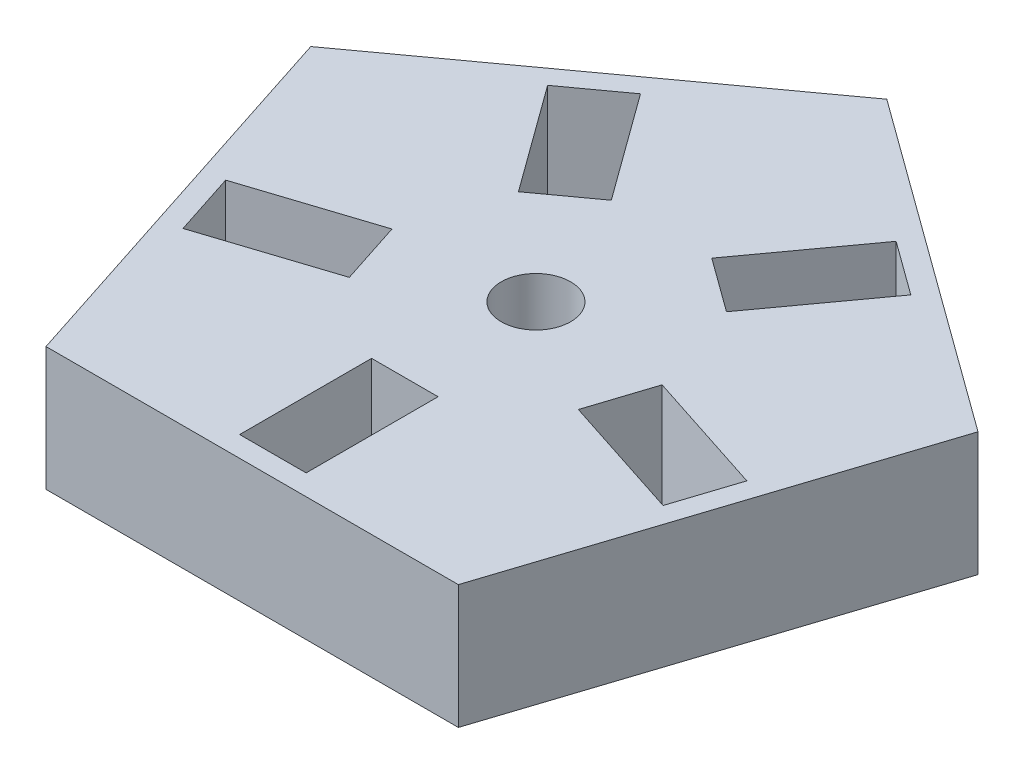
ISO-10303-21;
HEADER;
FILE_DESCRIPTION(('STEP AP214'),'2;1');
FILE_NAME('part.step','',(''),(''),'','','');
FILE_SCHEMA(('AUTOMOTIVE_DESIGN { 1 0 10303 214 1 1 1 1 }'));
ENDSEC;
DATA;
#1=APPLICATION_CONTEXT('core data for automotive mechanical design processes');
#2=APPLICATION_PROTOCOL_DEFINITION('international standard','automotive_design',2000,#1);
#3=PRODUCT_CONTEXT('',#1,'mechanical');
#4=PRODUCT('Part','Part','',(#3));
#5=PRODUCT_RELATED_PRODUCT_CATEGORY('part','',(#4));
#6=PRODUCT_DEFINITION_FORMATION('','',#4);
#7=PRODUCT_DEFINITION_CONTEXT('part definition',#1,'design');
#8=PRODUCT_DEFINITION('design','',#6,#7);
#9=PRODUCT_DEFINITION_SHAPE('','',#8);
#10=(LENGTH_UNIT() NAMED_UNIT(*) SI_UNIT(.MILLI.,.METRE.));
#11=(NAMED_UNIT(*) PLANE_ANGLE_UNIT() SI_UNIT($,.RADIAN.));
#12=(NAMED_UNIT(*) SI_UNIT($,.STERADIAN.) SOLID_ANGLE_UNIT());
#13=UNCERTAINTY_MEASURE_WITH_UNIT(LENGTH_MEASURE(1.E-05),#10,'distance_accuracy_value','');
#14=(GEOMETRIC_REPRESENTATION_CONTEXT(3) GLOBAL_UNCERTAINTY_ASSIGNED_CONTEXT((#13)) GLOBAL_UNIT_ASSIGNED_CONTEXT((#10,
#11,#12)) REPRESENTATION_CONTEXT('',''));
#15=CARTESIAN_POINT('',(0.,0.,0.));
#16=DIRECTION('',(0.,0.,1.));
#17=DIRECTION('',(1.,0.,0.));
#18=AXIS2_PLACEMENT_3D('',#15,#16,#17);
#19=CARTESIAN_POINT('',(-63.5056503261382,38.1,87.3827706180711));
#20=DIRECTION('',(-0.951065450191528,0.,0.308989497316633));
#21=DIRECTION('',(0.308989497316633,0.,0.951065450191528));
#22=AXIS2_PLACEMENT_3D('',#19,#20,#21);
#23=PLANE('',#22);
#24=DIRECTION('',(-0.308989497316633,0.,-0.951065450191529));
#25=VECTOR('',#24,1.);
#26=CARTESIAN_POINT('',(-63.5056503261382,0.,87.3827706180711));
#27=LINE('',#26,#25);
#28=CARTESIAN_POINT('',(-63.5056503261382,0.,87.3827706180711));
#29=VERTEX_POINT('',#28);
#30=CARTESIAN_POINT('',(-102.747316485351,0.,-33.402541556253));
#31=VERTEX_POINT('',#30);
#32=EDGE_CURVE('E367',#29,#31,#27,.T.);
#33=ORIENTED_EDGE('',*,*,#32,.F.);
#34=DIRECTION('',(0.,-1.,0.));
#35=VECTOR('',#34,1.);
#36=CARTESIAN_POINT('',(-63.5056503261382,38.1,87.3827706180711));
#37=LINE('',#36,#35);
#38=CARTESIAN_POINT('',(-63.5056503261382,38.1,87.3827706180711));
#39=VERTEX_POINT('',#38);
#40=EDGE_CURVE('E11',#39,#29,#37,.T.);
#41=ORIENTED_EDGE('',*,*,#40,.F.);
#42=DIRECTION('',(-0.308989497316633,0.,-0.951065450191529));
#43=VECTOR('',#42,1.);
#44=CARTESIAN_POINT('',(-63.5056503261382,38.1,87.3827706180711));
#45=LINE('',#44,#43);
#46=CARTESIAN_POINT('',(-102.747316485351,38.1,-33.402541556253));
#47=VERTEX_POINT('',#46);
#48=EDGE_CURVE('E374',#39,#47,#45,.T.);
#49=ORIENTED_EDGE('',*,*,#48,.T.);
#50=DIRECTION('',(0.,-1.,0.));
#51=VECTOR('',#50,1.);
#52=CARTESIAN_POINT('',(-102.747316485351,38.1,-33.402541556253));
#53=LINE('',#52,#51);
#54=EDGE_CURVE('E38',#47,#31,#53,.T.);
#55=ORIENTED_EDGE('',*,*,#54,.T.);
#56=EDGE_LOOP('',(#33,#41,#49,#55));
#57=FACE_BOUND('',#56,.T.);
#58=ADVANCED_FACE('F35',(#57),#23,.T.);
#59=CARTESIAN_POINT('',(63.4943496207819,38.1,87.3864424398222));
#60=DIRECTION('',(-2.8911982291864E-05,0.,0.999999999582049));
#61=DIRECTION('',(0.999999999582049,0.,2.8911982291864E-05));
#62=AXIS2_PLACEMENT_3D('',#59,#60,#61);
#63=PLANE('',#62);
#64=DIRECTION('',(-0.999999999582049,0.,-2.8911982291864E-05));
#65=VECTOR('',#64,1.);
#66=CARTESIAN_POINT('',(63.4943496207819,0.,87.3864424398222));
#67=LINE('',#66,#65);
#68=CARTESIAN_POINT('',(63.4943496207819,0.,87.3864424398222));
#69=VERTEX_POINT('',#68);
#70=EDGE_CURVE('E378',#69,#29,#67,.T.);
#71=ORIENTED_EDGE('',*,*,#70,.F.);
#72=DIRECTION('',(0.,-1.,0.));
#73=VECTOR('',#72,1.);
#74=CARTESIAN_POINT('',(63.4943496207819,38.1,87.3864424398222));
#75=LINE('',#74,#73);
#76=CARTESIAN_POINT('',(63.4943496207819,38.1,87.3864424398222));
#77=VERTEX_POINT('',#76);
#78=EDGE_CURVE('E43',#77,#69,#75,.T.);
#79=ORIENTED_EDGE('',*,*,#78,.F.);
#80=DIRECTION('',(-0.999999999582049,0.,-2.8911982291864E-05));
#81=VECTOR('',#80,1.);
#82=CARTESIAN_POINT('',(63.4943496207819,38.1,87.3864424398222));
#83=LINE('',#82,#81);
#84=EDGE_CURVE('E387',#77,#39,#83,.T.);
#85=ORIENTED_EDGE('',*,*,#84,.T.);
#86=ORIENTED_EDGE('',*,*,#40,.T.);
#87=EDGE_LOOP('',(#71,#79,#85,#86));
#88=FACE_BOUND('',#87,.T.);
#89=ADVANCED_FACE('F418',(#88),#63,.T.);
#90=CARTESIAN_POINT('',(102.743,38.1,-33.3966004238582));
#91=DIRECTION('',(0.95104758160379,0.,0.309044491174947));
#92=DIRECTION('',(0.309044491174947,0.,-0.95104758160379));
#93=AXIS2_PLACEMENT_3D('',#90,#91,#92);
#94=PLANE('',#93);
#95=DIRECTION('',(-0.309044491174947,0.,0.95104758160379));
#96=VECTOR('',#95,1.);
#97=CARTESIAN_POINT('',(102.743,0.,-33.3966004238582));
#98=LINE('',#97,#96);
#99=CARTESIAN_POINT('',(102.743,0.,-33.3966004238582));
#100=VERTEX_POINT('',#99);
#101=EDGE_CURVE('E398',#100,#69,#98,.T.);
#102=ORIENTED_EDGE('',*,*,#101,.F.);
#103=DIRECTION('',(0.,-1.,0.));
#104=VECTOR('',#103,1.);
#105=CARTESIAN_POINT('',(102.743,38.1,-33.3966004238582));
#106=LINE('',#105,#104);
#107=CARTESIAN_POINT('',(102.743,38.1,-33.3966004238582));
#108=VERTEX_POINT('',#107);
#109=EDGE_CURVE('E404',#108,#100,#106,.T.);
#110=ORIENTED_EDGE('',*,*,#109,.F.);
#111=DIRECTION('',(-0.309044491174947,0.,0.95104758160379));
#112=VECTOR('',#111,1.);
#113=CARTESIAN_POINT('',(102.743,38.1,-33.3966004238582));
#114=LINE('',#113,#112);
#115=EDGE_CURVE('E384',#108,#77,#114,.T.);
#116=ORIENTED_EDGE('',*,*,#115,.T.);
#117=ORIENTED_EDGE('',*,*,#78,.T.);
#118=EDGE_LOOP('',(#102,#110,#116,#117));
#119=FACE_BOUND('',#118,.T.);
#120=ADVANCED_FACE('F427',(#119),#94,.T.);
#121=CARTESIAN_POINT('',(0.,38.1,-108.048298));
#122=DIRECTION('',(0.58780864233183,0.,-0.809000000000007));
#123=DIRECTION('',(-0.809000000000007,0.,-0.58780864233183));
#124=AXIS2_PLACEMENT_3D('',#121,#122,#123);
#125=PLANE('',#124);
#126=DIRECTION('',(0.809000000000007,0.,0.58780864233183));
#127=VECTOR('',#126,1.);
#128=CARTESIAN_POINT('',(0.,0.,-108.048298));
#129=LINE('',#128,#127);
#130=CARTESIAN_POINT('',(0.,0.,-108.048298));
#131=VERTEX_POINT('',#130);
#132=EDGE_CURVE('E395',#131,#100,#129,.T.);
#133=ORIENTED_EDGE('',*,*,#132,.F.);
#134=DIRECTION('',(0.,-1.,0.));
#135=VECTOR('',#134,1.);
#136=CARTESIAN_POINT('',(0.,38.1,-108.048298));
#137=LINE('',#136,#135);
#138=CARTESIAN_POINT('',(0.,38.1,-108.048298));
#139=VERTEX_POINT('',#138);
#140=EDGE_CURVE('E405',#139,#131,#137,.T.);
#141=ORIENTED_EDGE('',*,*,#140,.F.);
#142=DIRECTION('',(0.809000000000007,0.,0.58780864233183));
#143=VECTOR('',#142,1.);
#144=CARTESIAN_POINT('',(0.,38.1,-108.048298));
#145=LINE('',#144,#143);
#146=EDGE_CURVE('E381',#139,#108,#145,.T.);
#147=ORIENTED_EDGE('',*,*,#146,.T.);
#148=ORIENTED_EDGE('',*,*,#109,.T.);
#149=EDGE_LOOP('',(#133,#141,#147,#148));
#150=FACE_BOUND('',#149,.T.);
#151=ADVANCED_FACE('F425',(#150),#125,.T.);
#152=CARTESIAN_POINT('',(-102.747316485351,38.1,-33.402541556253));
#153=DIRECTION('',(-0.587761861761788,0.,-0.809033988073627));
#154=DIRECTION('',(-0.809033988073627,0.,0.587761861761788));
#155=AXIS2_PLACEMENT_3D('',#152,#153,#154);
#156=PLANE('',#155);
#157=DIRECTION('',(0.809033988073627,0.,-0.587761861761788));
#158=VECTOR('',#157,1.);
#159=CARTESIAN_POINT('',(-102.747316485351,0.,-33.402541556253));
#160=LINE('',#159,#158);
#161=EDGE_CURVE('E392',#31,#131,#160,.T.);
#162=ORIENTED_EDGE('',*,*,#161,.F.);
#163=ORIENTED_EDGE('',*,*,#54,.F.);
#164=DIRECTION('',(0.809033988073627,0.,-0.587761861761788));
#165=VECTOR('',#164,1.);
#166=CARTESIAN_POINT('',(-102.747316485351,38.1,-33.402541556253));
#167=LINE('',#166,#165);
#168=EDGE_CURVE('E377',#47,#139,#167,.T.);
#169=ORIENTED_EDGE('',*,*,#168,.T.);
#170=ORIENTED_EDGE('',*,*,#140,.T.);
#171=EDGE_LOOP('',(#162,#163,#169,#170));
#172=FACE_BOUND('',#171,.T.);
#173=ADVANCED_FACE('F413',(#172),#156,.T.);
#174=CARTESIAN_POINT('',(0.,38.1,0.));
#175=DIRECTION('',(0.,-1.,0.));
#176=DIRECTION('',(0.,0.,-1.));
#177=AXIS2_PLACEMENT_3D('',#174,#175,#176);
#178=PLANE('',#177);
#179=CARTESIAN_POINT('',(0.,38.1,0.));
#180=DIRECTION('',(0.,-1.,0.));
#181=DIRECTION('',(0.,0.,-1.));
#182=AXIS2_PLACEMENT_3D('',#179,#180,#181);
#183=CIRCLE('',#182,10.680701413558);
#184=CARTESIAN_POINT('',(0.,38.1,-10.680701413558));
#185=VERTEX_POINT('',#184);
#186=EDGE_CURVE('E296',#185,#185,#183,.T.);
#187=ORIENTED_EDGE('',*,*,#186,.T.);
#188=EDGE_LOOP('',(#187));
#189=FACE_BOUND('',#188,.T.);
#190=DIRECTION('',(-0.30901699437496,0.,-0.951056516295149));
#191=VECTOR('',#190,1.);
#192=CARTESIAN_POINT('',(-35.2482917321554,38.1,22.2366078422844));
#193=LINE('',#192,#191);
#194=CARTESIAN_POINT('',(-35.2482917321554,38.1,22.2366078422844));
#195=VERTEX_POINT('',#194);
#196=CARTESIAN_POINT('',(-41.5746112477973,38.1,2.76619841808353));
#197=VERTEX_POINT('',#196);
#198=EDGE_CURVE('E295',#195,#197,#193,.T.);
#199=ORIENTED_EDGE('',*,*,#198,.F.);
#200=DIRECTION('',(0.95105651629515,0.,-0.30901699437496));
#201=VECTOR('',#200,1.);
#202=CARTESIAN_POINT('',(-73.8992285543903,38.1,34.7950584936827));
#203=LINE('',#202,#201);
#204=CARTESIAN_POINT('',(-73.8992285543903,38.1,34.7950584936827));
#205=VERTEX_POINT('',#204);
#206=EDGE_CURVE('E51',#205,#195,#203,.T.);
#207=ORIENTED_EDGE('',*,*,#206,.F.);
#208=DIRECTION('',(0.30901699437496,0.,0.95105651629515));
#209=VECTOR('',#208,1.);
#210=CARTESIAN_POINT('',(-73.8992285543903,38.1,34.7950584936827));
#211=LINE('',#210,#209);
#212=CARTESIAN_POINT('',(-80.2255480700322,38.1,15.3246490694819));
#213=VERTEX_POINT('',#212);
#214=EDGE_CURVE('E284',#213,#205,#211,.T.);
#215=ORIENTED_EDGE('',*,*,#214,.F.);
#216=DIRECTION('',(-0.95105651629515,0.,0.30901699437496));
#217=VECTOR('',#216,1.);
#218=CARTESIAN_POINT('',(-80.2255480700322,38.1,15.3246490694819));
#219=LINE('',#218,#217);
#220=EDGE_CURVE('E299',#197,#213,#219,.T.);
#221=ORIENTED_EDGE('',*,*,#220,.F.);
#222=EDGE_LOOP('',(#199,#207,#215,#221));
#223=FACE_BOUND('',#222,.T.);
#224=DIRECTION('',(0.809016994374942,0.,-0.587785252292481));
#225=VECTOR('',#224,1.);
#226=CARTESIAN_POINT('',(-32.0405919566263,38.1,-26.651627819622));
#227=LINE('',#226,#225);
#228=CARTESIAN_POINT('',(-32.0405919566263,38.1,-26.651627819622));
#229=VERTEX_POINT('',#228);
#230=CARTESIAN_POINT('',(-15.4780724409848,38.1,-38.6850026186546));
#231=VERTEX_POINT('',#230);
#232=EDGE_CURVE('E265',#229,#231,#227,.T.);
#233=ORIENTED_EDGE('',*,*,#232,.F.);
#234=DIRECTION('',(0.587785252292481,0.,0.809016994374942));
#235=VECTOR('',#234,1.);
#236=CARTESIAN_POINT('',(-55.9281846097928,38.1,-59.5300784710196));
#237=LINE('',#236,#235);
#238=CARTESIAN_POINT('',(-55.9281846097928,38.1,-59.5300784710196));
#239=VERTEX_POINT('',#238);
#240=EDGE_CURVE('E59',#239,#229,#237,.T.);
#241=ORIENTED_EDGE('',*,*,#240,.F.);
#242=DIRECTION('',(-0.809016994374942,0.,0.587785252292481));
#243=VECTOR('',#242,1.);
#244=CARTESIAN_POINT('',(-55.9281846097928,38.1,-59.5300784710196));
#245=LINE('',#244,#243);
#246=CARTESIAN_POINT('',(-39.3656650941512,38.1,-71.5634532700522));
#247=VERTEX_POINT('',#246);
#248=EDGE_CURVE('E254',#247,#239,#245,.T.);
#249=ORIENTED_EDGE('',*,*,#248,.F.);
#250=DIRECTION('',(-0.587785252292481,0.,-0.809016994374942));
#251=VECTOR('',#250,1.);
#252=CARTESIAN_POINT('',(-39.3656650941512,38.1,-71.5634532700522));
#253=LINE('',#252,#251);
#254=EDGE_CURVE('E269',#231,#247,#253,.T.);
#255=ORIENTED_EDGE('',*,*,#254,.F.);
#256=EDGE_LOOP('',(#233,#241,#249,#255));
#257=FACE_BOUND('',#256,.T.);
#258=DIRECTION('',(0.809016994374952,0.,0.587785252292468));
#259=VECTOR('',#258,1.);
#260=CARTESIAN_POINT('',(15.446116883294,38.1,-38.7082196903228));
#261=LINE('',#260,#259);
#262=CARTESIAN_POINT('',(15.446116883294,38.1,-38.7082196903228));
#263=VERTEX_POINT('',#262);
#264=CARTESIAN_POINT('',(32.0086363989358,38.1,-26.6748448912905));
#265=VERTEX_POINT('',#264);
#266=EDGE_CURVE('E239',#263,#265,#261,.T.);
#267=ORIENTED_EDGE('',*,*,#266,.F.);
#268=DIRECTION('',(-0.587785252292468,0.,0.809016994374951));
#269=VECTOR('',#268,1.);
#270=CARTESIAN_POINT('',(39.3337095364599,38.1,-71.5866703417209));
#271=LINE('',#270,#269);
#272=CARTESIAN_POINT('',(39.3337095364599,38.1,-71.5866703417209));
#273=VERTEX_POINT('',#272);
#274=EDGE_CURVE('E209',#273,#263,#271,.T.);
#275=ORIENTED_EDGE('',*,*,#274,.F.);
#276=DIRECTION('',(-0.809016994374951,0.,-0.587785252292468));
#277=VECTOR('',#276,1.);
#278=CARTESIAN_POINT('',(39.3337095364599,38.1,-71.5866703417209));
#279=LINE('',#278,#277);
#280=CARTESIAN_POINT('',(55.8962290521017,38.1,-59.5532955426885));
#281=VERTEX_POINT('',#280);
#282=EDGE_CURVE('E227',#281,#273,#279,.T.);
#283=ORIENTED_EDGE('',*,*,#282,.F.);
#284=DIRECTION('',(0.587785252292468,0.,-0.809016994374951));
#285=VECTOR('',#284,1.);
#286=CARTESIAN_POINT('',(55.8962290521017,38.1,-59.5532955426885));
#287=LINE('',#286,#285);
#288=EDGE_CURVE('E230',#265,#281,#287,.T.);
#289=ORIENTED_EDGE('',*,*,#288,.F.);
#290=EDGE_LOOP('',(#267,#275,#283,#289));
#291=FACE_BOUND('',#290,.T.);
#292=DIRECTION('',(-0.309016994374944,0.,0.951056516295155));
#293=VECTOR('',#292,1.);
#294=CARTESIAN_POINT('',(41.5868171847056,38.1,2.7286324070048));
#295=LINE('',#294,#293);
#296=CARTESIAN_POINT('',(41.5868171847056,38.1,2.7286324070048));
#297=VERTEX_POINT('',#296);
#298=CARTESIAN_POINT('',(35.260497669064,38.1,22.1990418312057));
#299=VERTEX_POINT('',#298);
#300=EDGE_CURVE('E325',#297,#299,#295,.T.);
#301=ORIENTED_EDGE('',*,*,#300,.F.);
#302=DIRECTION('',(-0.951056516295155,0.,-0.309016994374944));
#303=VECTOR('',#302,1.);
#304=CARTESIAN_POINT('',(80.2377540069406,38.1,15.2870830584025));
#305=LINE('',#304,#303);
#306=CARTESIAN_POINT('',(80.2377540069406,38.1,15.2870830584025));
#307=VERTEX_POINT('',#306);
#308=EDGE_CURVE('E246',#307,#297,#305,.T.);
#309=ORIENTED_EDGE('',*,*,#308,.F.);
#310=DIRECTION('',(0.309016994374944,0.,-0.951056516295155));
#311=VECTOR('',#310,1.);
#312=CARTESIAN_POINT('',(80.2377540069406,38.1,15.2870830584025));
#313=LINE('',#312,#311);
#314=CARTESIAN_POINT('',(73.911434491299,38.1,34.7574924826035));
#315=VERTEX_POINT('',#314);
#316=EDGE_CURVE('E314',#315,#307,#313,.T.);
#317=ORIENTED_EDGE('',*,*,#316,.F.);
#318=DIRECTION('',(0.951056516295155,0.,0.309016994374944));
#319=VECTOR('',#318,1.);
#320=CARTESIAN_POINT('',(73.911434491299,38.1,34.7574924826035));
#321=LINE('',#320,#319);
#322=EDGE_CURVE('E328',#299,#315,#321,.T.);
#323=ORIENTED_EDGE('',*,*,#322,.F.);
#324=EDGE_LOOP('',(#301,#309,#317,#323));
#325=FACE_BOUND('',#324,.T.);
#326=DIRECTION('',(-1.,0.,0.));
#327=VECTOR('',#326,1.);
#328=CARTESIAN_POINT('',(10.2559496207819,38.1,40.3946072606562));
#329=LINE('',#328,#327);
#330=CARTESIAN_POINT('',(10.2559496207819,38.1,40.3946072606562));
#331=VERTEX_POINT('',#330);
#332=CARTESIAN_POINT('',(-10.2164503792181,38.1,40.3946072606562));
#333=VERTEX_POINT('',#332);
#334=EDGE_CURVE('E357',#331,#333,#329,.T.);
#335=ORIENTED_EDGE('',*,*,#334,.F.);
#336=DIRECTION('',(0.,0.,-1.));
#337=VECTOR('',#336,1.);
#338=CARTESIAN_POINT('',(10.2559496207819,38.1,81.0346072606562));
#339=LINE('',#338,#337);
#340=CARTESIAN_POINT('',(10.2559496207819,38.1,81.0346072606562));
#341=VERTEX_POINT('',#340);
#342=EDGE_CURVE('E335',#341,#331,#339,.T.);
#343=ORIENTED_EDGE('',*,*,#342,.F.);
#344=DIRECTION('',(1.,0.,0.));
#345=VECTOR('',#344,1.);
#346=CARTESIAN_POINT('',(10.2559496207819,38.1,81.0346072606562));
#347=LINE('',#346,#345);
#348=CARTESIAN_POINT('',(-10.2164503792181,38.1,81.0346072606562));
#349=VERTEX_POINT('',#348);
#350=EDGE_CURVE('E346',#349,#341,#347,.T.);
#351=ORIENTED_EDGE('',*,*,#350,.F.);
#352=DIRECTION('',(0.,0.,1.));
#353=VECTOR('',#352,1.);
#354=CARTESIAN_POINT('',(-10.2164503792181,38.1,81.0346072606562));
#355=LINE('',#354,#353);
#356=EDGE_CURVE('E360',#333,#349,#355,.T.);
#357=ORIENTED_EDGE('',*,*,#356,.F.);
#358=EDGE_LOOP('',(#335,#343,#351,#357));
#359=FACE_BOUND('',#358,.T.);
#360=ORIENTED_EDGE('',*,*,#48,.F.);
#361=ORIENTED_EDGE('',*,*,#84,.F.);
#362=ORIENTED_EDGE('',*,*,#115,.F.);
#363=ORIENTED_EDGE('',*,*,#146,.F.);
#364=ORIENTED_EDGE('',*,*,#168,.F.);
#365=EDGE_LOOP('',(#360,#361,#362,#363,#364));
#366=FACE_BOUND('',#365,.T.);
#367=ADVANCED_FACE('F421',(#189,#223,#257,#291,#325,#359,#366),#178,.F.);
#368=CARTESIAN_POINT('',(0.,0.,0.));
#369=DIRECTION('',(0.,-1.,0.));
#370=DIRECTION('',(0.,0.,-1.));
#371=AXIS2_PLACEMENT_3D('',#368,#369,#370);
#372=PLANE('',#371);
#373=CARTESIAN_POINT('',(0.,0.,0.));
#374=DIRECTION('',(0.,-1.,0.));
#375=DIRECTION('',(0.,0.,-1.));
#376=AXIS2_PLACEMENT_3D('',#373,#374,#375);
#377=CIRCLE('',#376,10.680701413558);
#378=CARTESIAN_POINT('',(0.,0.,-10.680701413558));
#379=VERTEX_POINT('',#378);
#380=EDGE_CURVE('E233',#379,#379,#377,.T.);
#381=ORIENTED_EDGE('',*,*,#380,.F.);
#382=EDGE_LOOP('',(#381));
#383=FACE_BOUND('',#382,.T.);
#384=DIRECTION('',(0.95105651629515,0.,-0.30901699437496));
#385=VECTOR('',#384,1.);
#386=CARTESIAN_POINT('',(-73.8992285543903,0.,34.7950584936827));
#387=LINE('',#386,#385);
#388=CARTESIAN_POINT('',(-73.8992285543903,0.,34.7950584936827));
#389=VERTEX_POINT('',#388);
#390=CARTESIAN_POINT('',(-35.2482917321554,0.,22.2366078422844));
#391=VERTEX_POINT('',#390);
#392=EDGE_CURVE('E280',#389,#391,#387,.T.);
#393=ORIENTED_EDGE('',*,*,#392,.T.);
#394=DIRECTION('',(-0.30901699437496,0.,-0.951056516295149));
#395=VECTOR('',#394,1.);
#396=CARTESIAN_POINT('',(-35.2482917321554,0.,22.2366078422844));
#397=LINE('',#396,#395);
#398=CARTESIAN_POINT('',(-41.5746112477974,0.,2.76619841808353));
#399=VERTEX_POINT('',#398);
#400=EDGE_CURVE('E283',#391,#399,#397,.T.);
#401=ORIENTED_EDGE('',*,*,#400,.T.);
#402=DIRECTION('',(-0.95105651629515,0.,0.30901699437496));
#403=VECTOR('',#402,1.);
#404=CARTESIAN_POINT('',(-80.2255480700322,0.,15.3246490694819));
#405=LINE('',#404,#403);
#406=CARTESIAN_POINT('',(-80.2255480700322,0.,15.3246490694819));
#407=VERTEX_POINT('',#406);
#408=EDGE_CURVE('E287',#399,#407,#405,.T.);
#409=ORIENTED_EDGE('',*,*,#408,.T.);
#410=DIRECTION('',(0.30901699437496,0.,0.95105651629515));
#411=VECTOR('',#410,1.);
#412=CARTESIAN_POINT('',(-73.8992285543903,0.,34.7950584936827));
#413=LINE('',#412,#411);
#414=EDGE_CURVE('E290',#407,#389,#413,.T.);
#415=ORIENTED_EDGE('',*,*,#414,.T.);
#416=EDGE_LOOP('',(#393,#401,#409,#415));
#417=FACE_BOUND('',#416,.T.);
#418=DIRECTION('',(0.587785252292481,0.,0.809016994374942));
#419=VECTOR('',#418,1.);
#420=CARTESIAN_POINT('',(-55.9281846097928,0.,-59.5300784710196));
#421=LINE('',#420,#419);
#422=CARTESIAN_POINT('',(-55.9281846097928,0.,-59.5300784710196));
#423=VERTEX_POINT('',#422);
#424=CARTESIAN_POINT('',(-32.0405919566263,0.,-26.651627819622));
#425=VERTEX_POINT('',#424);
#426=EDGE_CURVE('E250',#423,#425,#421,.T.);
#427=ORIENTED_EDGE('',*,*,#426,.T.);
#428=DIRECTION('',(0.809016994374942,0.,-0.587785252292481));
#429=VECTOR('',#428,1.);
#430=CARTESIAN_POINT('',(-32.0405919566263,0.,-26.651627819622));
#431=LINE('',#430,#429);
#432=CARTESIAN_POINT('',(-15.4780724409848,0.,-38.6850026186546));
#433=VERTEX_POINT('',#432);
#434=EDGE_CURVE('E253',#425,#433,#431,.T.);
#435=ORIENTED_EDGE('',*,*,#434,.T.);
#436=DIRECTION('',(-0.587785252292481,0.,-0.809016994374942));
#437=VECTOR('',#436,1.);
#438=CARTESIAN_POINT('',(-39.3656650941512,0.,-71.5634532700522));
#439=LINE('',#438,#437);
#440=CARTESIAN_POINT('',(-39.3656650941512,0.,-71.5634532700522));
#441=VERTEX_POINT('',#440);
#442=EDGE_CURVE('E257',#433,#441,#439,.T.);
#443=ORIENTED_EDGE('',*,*,#442,.T.);
#444=DIRECTION('',(-0.809016994374942,0.,0.587785252292481));
#445=VECTOR('',#444,1.);
#446=CARTESIAN_POINT('',(-55.9281846097928,0.,-59.5300784710196));
#447=LINE('',#446,#445);
#448=EDGE_CURVE('E260',#441,#423,#447,.T.);
#449=ORIENTED_EDGE('',*,*,#448,.T.);
#450=EDGE_LOOP('',(#427,#435,#443,#449));
#451=FACE_BOUND('',#450,.T.);
#452=DIRECTION('',(-0.587785252292468,0.,0.809016994374951));
#453=VECTOR('',#452,1.);
#454=CARTESIAN_POINT('',(39.3337095364599,0.,-71.5866703417209));
#455=LINE('',#454,#453);
#456=CARTESIAN_POINT('',(39.3337095364599,0.,-71.5866703417209));
#457=VERTEX_POINT('',#456);
#458=CARTESIAN_POINT('',(15.446116883294,0.,-38.7082196903228));
#459=VERTEX_POINT('',#458);
#460=EDGE_CURVE('E206',#457,#459,#455,.T.);
#461=ORIENTED_EDGE('',*,*,#460,.T.);
#462=DIRECTION('',(0.809016994374952,0.,0.587785252292468));
#463=VECTOR('',#462,1.);
#464=CARTESIAN_POINT('',(15.446116883294,0.,-38.7082196903228));
#465=LINE('',#464,#463);
#466=CARTESIAN_POINT('',(32.0086363989358,0.,-26.6748448912905));
#467=VERTEX_POINT('',#466);
#468=EDGE_CURVE('E218',#459,#467,#465,.T.);
#469=ORIENTED_EDGE('',*,*,#468,.T.);
#470=DIRECTION('',(0.587785252292468,0.,-0.809016994374951));
#471=VECTOR('',#470,1.);
#472=CARTESIAN_POINT('',(55.8962290521017,0.,-59.5532955426885));
#473=LINE('',#472,#471);
#474=CARTESIAN_POINT('',(55.8962290521017,0.,-59.5532955426885));
#475=VERTEX_POINT('',#474);
#476=EDGE_CURVE('E222',#467,#475,#473,.T.);
#477=ORIENTED_EDGE('',*,*,#476,.T.);
#478=DIRECTION('',(-0.809016994374951,0.,-0.587785252292468));
#479=VECTOR('',#478,1.);
#480=CARTESIAN_POINT('',(39.3337095364599,0.,-71.5866703417209));
#481=LINE('',#480,#479);
#482=EDGE_CURVE('E214',#475,#457,#481,.T.);
#483=ORIENTED_EDGE('',*,*,#482,.T.);
#484=EDGE_LOOP('',(#461,#469,#477,#483));
#485=FACE_BOUND('',#484,.T.);
#486=DIRECTION('',(-0.951056516295155,0.,-0.309016994374944));
#487=VECTOR('',#486,1.);
#488=CARTESIAN_POINT('',(80.2377540069406,0.,15.2870830584025));
#489=LINE('',#488,#487);
#490=CARTESIAN_POINT('',(80.2377540069406,0.,15.2870830584025));
#491=VERTEX_POINT('',#490);
#492=CARTESIAN_POINT('',(41.5868171847056,0.,2.7286324070048));
#493=VERTEX_POINT('',#492);
#494=EDGE_CURVE('E310',#491,#493,#489,.T.);
#495=ORIENTED_EDGE('',*,*,#494,.T.);
#496=DIRECTION('',(-0.309016994374944,0.,0.951056516295155));
#497=VECTOR('',#496,1.);
#498=CARTESIAN_POINT('',(41.5868171847056,0.,2.7286324070048));
#499=LINE('',#498,#497);
#500=CARTESIAN_POINT('',(35.2604976690639,0.,22.1990418312057));
#501=VERTEX_POINT('',#500);
#502=EDGE_CURVE('E313',#493,#501,#499,.T.);
#503=ORIENTED_EDGE('',*,*,#502,.T.);
#504=DIRECTION('',(0.951056516295155,0.,0.309016994374944));
#505=VECTOR('',#504,1.);
#506=CARTESIAN_POINT('',(73.911434491299,0.,34.7574924826035));
#507=LINE('',#506,#505);
#508=CARTESIAN_POINT('',(73.911434491299,0.,34.7574924826035));
#509=VERTEX_POINT('',#508);
#510=EDGE_CURVE('E317',#501,#509,#507,.T.);
#511=ORIENTED_EDGE('',*,*,#510,.T.);
#512=DIRECTION('',(0.309016994374944,0.,-0.951056516295155));
#513=VECTOR('',#512,1.);
#514=CARTESIAN_POINT('',(80.2377540069406,0.,15.2870830584025));
#515=LINE('',#514,#513);
#516=EDGE_CURVE('E320',#509,#491,#515,.T.);
#517=ORIENTED_EDGE('',*,*,#516,.T.);
#518=EDGE_LOOP('',(#495,#503,#511,#517));
#519=FACE_BOUND('',#518,.T.);
#520=DIRECTION('',(0.,0.,-1.));
#521=VECTOR('',#520,1.);
#522=CARTESIAN_POINT('',(10.2559496207819,0.,81.0346072606562));
#523=LINE('',#522,#521);
#524=CARTESIAN_POINT('',(10.2559496207819,0.,81.0346072606562));
#525=VERTEX_POINT('',#524);
#526=CARTESIAN_POINT('',(10.2559496207819,0.,40.3946072606562));
#527=VERTEX_POINT('',#526);
#528=EDGE_CURVE('E342',#525,#527,#523,.T.);
#529=ORIENTED_EDGE('',*,*,#528,.T.);
#530=DIRECTION('',(-1.,0.,0.));
#531=VECTOR('',#530,1.);
#532=CARTESIAN_POINT('',(10.2559496207819,0.,40.3946072606562));
#533=LINE('',#532,#531);
#534=CARTESIAN_POINT('',(-10.2164503792181,0.,40.3946072606562));
#535=VERTEX_POINT('',#534);
#536=EDGE_CURVE('E345',#527,#535,#533,.T.);
#537=ORIENTED_EDGE('',*,*,#536,.T.);
#538=DIRECTION('',(0.,0.,1.));
#539=VECTOR('',#538,1.);
#540=CARTESIAN_POINT('',(-10.2164503792181,0.,81.0346072606562));
#541=LINE('',#540,#539);
#542=CARTESIAN_POINT('',(-10.2164503792181,0.,81.0346072606562));
#543=VERTEX_POINT('',#542);
#544=EDGE_CURVE('E349',#535,#543,#541,.T.);
#545=ORIENTED_EDGE('',*,*,#544,.T.);
#546=DIRECTION('',(1.,0.,0.));
#547=VECTOR('',#546,1.);
#548=CARTESIAN_POINT('',(10.2559496207819,0.,81.0346072606562));
#549=LINE('',#548,#547);
#550=EDGE_CURVE('E352',#543,#525,#549,.T.);
#551=ORIENTED_EDGE('',*,*,#550,.T.);
#552=EDGE_LOOP('',(#529,#537,#545,#551));
#553=FACE_BOUND('',#552,.T.);
#554=ORIENTED_EDGE('',*,*,#32,.T.);
#555=ORIENTED_EDGE('',*,*,#161,.T.);
#556=ORIENTED_EDGE('',*,*,#132,.T.);
#557=ORIENTED_EDGE('',*,*,#101,.T.);
#558=ORIENTED_EDGE('',*,*,#70,.T.);
#559=EDGE_LOOP('',(#554,#555,#556,#557,#558));
#560=FACE_BOUND('',#559,.T.);
#561=ADVANCED_FACE('F224',(#383,#417,#451,#485,#519,#553,#560),#372,.T.);
#562=CARTESIAN_POINT('',(10.2559496207819,0.,81.0346072606562));
#563=DIRECTION('',(1.,0.,0.));
#564=DIRECTION('',(0.,0.,-1.));
#565=AXIS2_PLACEMENT_3D('',#562,#563,#564);
#566=PLANE('',#565);
#567=ORIENTED_EDGE('',*,*,#342,.T.);
#568=DIRECTION('',(0.,1.,0.));
#569=VECTOR('',#568,1.);
#570=CARTESIAN_POINT('',(10.2559496207819,0.,40.3946072606562));
#571=LINE('',#570,#569);
#572=EDGE_CURVE('E355',#527,#331,#571,.T.);
#573=ORIENTED_EDGE('',*,*,#572,.F.);
#574=ORIENTED_EDGE('',*,*,#528,.F.);
#575=DIRECTION('',(0.,1.,0.));
#576=VECTOR('',#575,1.);
#577=CARTESIAN_POINT('',(10.2559496207819,0.,81.0346072606562));
#578=LINE('',#577,#576);
#579=EDGE_CURVE('E365',#525,#341,#578,.T.);
#580=ORIENTED_EDGE('',*,*,#579,.T.);
#581=EDGE_LOOP('',(#567,#573,#574,#580));
#582=FACE_BOUND('',#581,.T.);
#583=ADVANCED_FACE('F467',(#582),#566,.F.);
#584=CARTESIAN_POINT('',(10.2559496207819,0.,81.0346072606562));
#585=DIRECTION('',(0.,0.,1.));
#586=DIRECTION('',(1.,0.,0.));
#587=AXIS2_PLACEMENT_3D('',#584,#585,#586);
#588=PLANE('',#587);
#589=ORIENTED_EDGE('',*,*,#350,.T.);
#590=ORIENTED_EDGE('',*,*,#579,.F.);
#591=ORIENTED_EDGE('',*,*,#550,.F.);
#592=DIRECTION('',(0.,1.,0.));
#593=VECTOR('',#592,1.);
#594=CARTESIAN_POINT('',(-10.2164503792181,0.,81.0346072606562));
#595=LINE('',#594,#593);
#596=EDGE_CURVE('E368',#543,#349,#595,.T.);
#597=ORIENTED_EDGE('',*,*,#596,.T.);
#598=EDGE_LOOP('',(#589,#590,#591,#597));
#599=FACE_BOUND('',#598,.T.);
#600=ADVANCED_FACE('F472',(#599),#588,.F.);
#601=CARTESIAN_POINT('',(-10.2164503792181,0.,81.0346072606562));
#602=DIRECTION('',(-1.,0.,0.));
#603=DIRECTION('',(0.,0.,1.));
#604=AXIS2_PLACEMENT_3D('',#601,#602,#603);
#605=PLANE('',#604);
#606=ORIENTED_EDGE('',*,*,#356,.T.);
#607=ORIENTED_EDGE('',*,*,#596,.F.);
#608=ORIENTED_EDGE('',*,*,#544,.F.);
#609=DIRECTION('',(0.,1.,0.));
#610=VECTOR('',#609,1.);
#611=CARTESIAN_POINT('',(-10.2164503792181,0.,40.3946072606562));
#612=LINE('',#611,#610);
#613=EDGE_CURVE('E370',#535,#333,#612,.T.);
#614=ORIENTED_EDGE('',*,*,#613,.T.);
#615=EDGE_LOOP('',(#606,#607,#608,#614));
#616=FACE_BOUND('',#615,.T.);
#617=ADVANCED_FACE('F484',(#616),#605,.F.);
#618=CARTESIAN_POINT('',(10.2559496207819,0.,40.3946072606562));
#619=DIRECTION('',(0.,0.,-1.));
#620=DIRECTION('',(-1.,0.,0.));
#621=AXIS2_PLACEMENT_3D('',#618,#619,#620);
#622=PLANE('',#621);
#623=ORIENTED_EDGE('',*,*,#334,.T.);
#624=ORIENTED_EDGE('',*,*,#613,.F.);
#625=ORIENTED_EDGE('',*,*,#536,.F.);
#626=ORIENTED_EDGE('',*,*,#572,.T.);
#627=EDGE_LOOP('',(#623,#624,#625,#626));
#628=FACE_BOUND('',#627,.T.);
#629=ADVANCED_FACE('F494',(#628),#622,.F.);
#630=CARTESIAN_POINT('',(80.2377540069406,0.,15.2870830584025));
#631=DIRECTION('',(0.309016994374944,0.,-0.951056516295155));
#632=DIRECTION('',(-0.951056516295155,0.,-0.309016994374944));
#633=AXIS2_PLACEMENT_3D('',#630,#631,#632);
#634=PLANE('',#633);
#635=ORIENTED_EDGE('',*,*,#308,.T.);
#636=DIRECTION('',(0.,1.,0.));
#637=VECTOR('',#636,1.);
#638=CARTESIAN_POINT('',(41.5868171847056,0.,2.7286324070048));
#639=LINE('',#638,#637);
#640=EDGE_CURVE('E323',#493,#297,#639,.T.);
#641=ORIENTED_EDGE('',*,*,#640,.F.);
#642=ORIENTED_EDGE('',*,*,#494,.F.);
#643=DIRECTION('',(0.,1.,0.));
#644=VECTOR('',#643,1.);
#645=CARTESIAN_POINT('',(80.2377540069406,0.,15.2870830584025));
#646=LINE('',#645,#644);
#647=EDGE_CURVE('E333',#491,#307,#646,.T.);
#648=ORIENTED_EDGE('',*,*,#647,.T.);
#649=EDGE_LOOP('',(#635,#641,#642,#648));
#650=FACE_BOUND('',#649,.T.);
#651=ADVANCED_FACE('F504',(#650),#634,.F.);
#652=CARTESIAN_POINT('',(80.2377540069406,0.,15.2870830584025));
#653=DIRECTION('',(0.951056516295155,0.,0.309016994374944));
#654=DIRECTION('',(0.309016994374944,0.,-0.951056516295155));
#655=AXIS2_PLACEMENT_3D('',#652,#653,#654);
#656=PLANE('',#655);
#657=ORIENTED_EDGE('',*,*,#316,.T.);
#658=ORIENTED_EDGE('',*,*,#647,.F.);
#659=ORIENTED_EDGE('',*,*,#516,.F.);
#660=DIRECTION('',(0.,1.,0.));
#661=VECTOR('',#660,1.);
#662=CARTESIAN_POINT('',(73.911434491299,0.,34.7574924826035));
#663=LINE('',#662,#661);
#664=EDGE_CURVE('E336',#509,#315,#663,.T.);
#665=ORIENTED_EDGE('',*,*,#664,.T.);
#666=EDGE_LOOP('',(#657,#658,#659,#665));
#667=FACE_BOUND('',#666,.T.);
#668=ADVANCED_FACE('F514',(#667),#656,.F.);
#669=CARTESIAN_POINT('',(73.911434491299,0.,34.7574924826035));
#670=DIRECTION('',(-0.309016994374944,0.,0.951056516295155));
#671=DIRECTION('',(0.951056516295155,0.,0.309016994374944));
#672=AXIS2_PLACEMENT_3D('',#669,#670,#671);
#673=PLANE('',#672);
#674=ORIENTED_EDGE('',*,*,#322,.T.);
#675=ORIENTED_EDGE('',*,*,#664,.F.);
#676=ORIENTED_EDGE('',*,*,#510,.F.);
#677=DIRECTION('',(0.,1.,0.));
#678=VECTOR('',#677,1.);
#679=CARTESIAN_POINT('',(35.260497669064,0.,22.1990418312057));
#680=LINE('',#679,#678);
#681=EDGE_CURVE('E338',#501,#299,#680,.T.);
#682=ORIENTED_EDGE('',*,*,#681,.T.);
#683=EDGE_LOOP('',(#674,#675,#676,#682));
#684=FACE_BOUND('',#683,.T.);
#685=ADVANCED_FACE('F524',(#684),#673,.F.);
#686=CARTESIAN_POINT('',(41.5868171847056,0.,2.7286324070048));
#687=DIRECTION('',(-0.951056516295155,0.,-0.309016994374944));
#688=DIRECTION('',(-0.309016994374944,0.,0.951056516295155));
#689=AXIS2_PLACEMENT_3D('',#686,#687,#688);
#690=PLANE('',#689);
#691=ORIENTED_EDGE('',*,*,#300,.T.);
#692=ORIENTED_EDGE('',*,*,#681,.F.);
#693=ORIENTED_EDGE('',*,*,#502,.F.);
#694=ORIENTED_EDGE('',*,*,#640,.T.);
#695=EDGE_LOOP('',(#691,#692,#693,#694));
#696=FACE_BOUND('',#695,.T.);
#697=ADVANCED_FACE('F534',(#696),#690,.F.);
#698=CARTESIAN_POINT('',(39.3337095364599,0.,-71.5866703417209));
#699=DIRECTION('',(-0.809016994374951,0.,-0.587785252292468));
#700=DIRECTION('',(-0.587785252292468,0.,0.809016994374951));
#701=AXIS2_PLACEMENT_3D('',#698,#699,#700);
#702=PLANE('',#701);
#703=ORIENTED_EDGE('',*,*,#274,.T.);
#704=DIRECTION('',(0.,1.,0.));
#705=VECTOR('',#704,1.);
#706=CARTESIAN_POINT('',(15.446116883294,0.,-38.7082196903228));
#707=LINE('',#706,#705);
#708=EDGE_CURVE('E202',#459,#263,#707,.T.);
#709=ORIENTED_EDGE('',*,*,#708,.F.);
#710=ORIENTED_EDGE('',*,*,#460,.F.);
#711=DIRECTION('',(0.,1.,0.));
#712=VECTOR('',#711,1.);
#713=CARTESIAN_POINT('',(39.3337095364599,0.,-71.5866703417209));
#714=LINE('',#713,#712);
#715=EDGE_CURVE('E244',#457,#273,#714,.T.);
#716=ORIENTED_EDGE('',*,*,#715,.T.);
#717=EDGE_LOOP('',(#703,#709,#710,#716));
#718=FACE_BOUND('',#717,.T.);
#719=ADVANCED_FACE('F204',(#718),#702,.F.);
#720=CARTESIAN_POINT('',(39.3337095364599,0.,-71.5866703417209));
#721=DIRECTION('',(0.587785252292468,0.,-0.809016994374951));
#722=DIRECTION('',(-0.809016994374951,0.,-0.587785252292468));
#723=AXIS2_PLACEMENT_3D('',#720,#721,#722);
#724=PLANE('',#723);
#725=ORIENTED_EDGE('',*,*,#282,.T.);
#726=ORIENTED_EDGE('',*,*,#715,.F.);
#727=ORIENTED_EDGE('',*,*,#482,.F.);
#728=DIRECTION('',(0.,1.,0.));
#729=VECTOR('',#728,1.);
#730=CARTESIAN_POINT('',(55.8962290521017,0.,-59.5532955426885));
#731=LINE('',#730,#729);
#732=EDGE_CURVE('E247',#475,#281,#731,.T.);
#733=ORIENTED_EDGE('',*,*,#732,.T.);
#734=EDGE_LOOP('',(#725,#726,#727,#733));
#735=FACE_BOUND('',#734,.T.);
#736=ADVANCED_FACE('F553',(#735),#724,.F.);
#737=CARTESIAN_POINT('',(55.8962290521017,0.,-59.5532955426885));
#738=DIRECTION('',(0.809016994374951,0.,0.587785252292468));
#739=DIRECTION('',(0.587785252292468,0.,-0.809016994374951));
#740=AXIS2_PLACEMENT_3D('',#737,#738,#739);
#741=PLANE('',#740);
#742=ORIENTED_EDGE('',*,*,#288,.T.);
#743=ORIENTED_EDGE('',*,*,#732,.F.);
#744=ORIENTED_EDGE('',*,*,#476,.F.);
#745=DIRECTION('',(0.,1.,0.));
#746=VECTOR('',#745,1.);
#747=CARTESIAN_POINT('',(32.0086363989358,0.,-26.6748448912905));
#748=LINE('',#747,#746);
#749=EDGE_CURVE('E213',#467,#265,#748,.T.);
#750=ORIENTED_EDGE('',*,*,#749,.T.);
#751=EDGE_LOOP('',(#742,#743,#744,#750));
#752=FACE_BOUND('',#751,.T.);
#753=ADVANCED_FACE('F562',(#752),#741,.F.);
#754=CARTESIAN_POINT('',(15.446116883294,0.,-38.7082196903228));
#755=DIRECTION('',(-0.587785252292467,0.,0.809016994374951));
#756=DIRECTION('',(0.809016994374951,0.,0.587785252292467));
#757=AXIS2_PLACEMENT_3D('',#754,#755,#756);
#758=PLANE('',#757);
#759=ORIENTED_EDGE('',*,*,#266,.T.);
#760=ORIENTED_EDGE('',*,*,#749,.F.);
#761=ORIENTED_EDGE('',*,*,#468,.F.);
#762=ORIENTED_EDGE('',*,*,#708,.T.);
#763=EDGE_LOOP('',(#759,#760,#761,#762));
#764=FACE_BOUND('',#763,.T.);
#765=ADVANCED_FACE('F219',(#764),#758,.F.);
#766=CARTESIAN_POINT('',(-55.9281846097928,0.,-59.5300784710196));
#767=DIRECTION('',(-0.809016994374942,0.,0.587785252292481));
#768=DIRECTION('',(0.587785252292481,0.,0.809016994374942));
#769=AXIS2_PLACEMENT_3D('',#766,#767,#768);
#770=PLANE('',#769);
#771=ORIENTED_EDGE('',*,*,#240,.T.);
#772=DIRECTION('',(0.,1.,0.));
#773=VECTOR('',#772,1.);
#774=CARTESIAN_POINT('',(-32.0405919566263,0.,-26.651627819622));
#775=LINE('',#774,#773);
#776=EDGE_CURVE('E263',#425,#229,#775,.T.);
#777=ORIENTED_EDGE('',*,*,#776,.F.);
#778=ORIENTED_EDGE('',*,*,#426,.F.);
#779=DIRECTION('',(0.,1.,0.));
#780=VECTOR('',#779,1.);
#781=CARTESIAN_POINT('',(-55.9281846097928,0.,-59.5300784710196));
#782=LINE('',#781,#780);
#783=EDGE_CURVE('E240',#423,#239,#782,.T.);
#784=ORIENTED_EDGE('',*,*,#783,.T.);
#785=EDGE_LOOP('',(#771,#777,#778,#784));
#786=FACE_BOUND('',#785,.T.);
#787=ADVANCED_FACE('F581',(#786),#770,.F.);
#788=CARTESIAN_POINT('',(-55.9281846097928,0.,-59.5300784710196));
#789=DIRECTION('',(-0.587785252292481,0.,-0.809016994374942));
#790=DIRECTION('',(-0.809016994374942,0.,0.587785252292481));
#791=AXIS2_PLACEMENT_3D('',#788,#789,#790);
#792=PLANE('',#791);
#793=ORIENTED_EDGE('',*,*,#248,.T.);
#794=ORIENTED_EDGE('',*,*,#783,.F.);
#795=ORIENTED_EDGE('',*,*,#448,.F.);
#796=DIRECTION('',(0.,1.,0.));
#797=VECTOR('',#796,1.);
#798=CARTESIAN_POINT('',(-39.3656650941512,0.,-71.5634532700522));
#799=LINE('',#798,#797);
#800=EDGE_CURVE('E275',#441,#247,#799,.T.);
#801=ORIENTED_EDGE('',*,*,#800,.T.);
#802=EDGE_LOOP('',(#793,#794,#795,#801));
#803=FACE_BOUND('',#802,.T.);
#804=ADVANCED_FACE('F590',(#803),#792,.F.);
#805=CARTESIAN_POINT('',(-39.3656650941512,0.,-71.5634532700522));
#806=DIRECTION('',(0.809016994374942,0.,-0.587785252292481));
#807=DIRECTION('',(-0.587785252292481,0.,-0.809016994374942));
#808=AXIS2_PLACEMENT_3D('',#805,#806,#807);
#809=PLANE('',#808);
#810=ORIENTED_EDGE('',*,*,#254,.T.);
#811=ORIENTED_EDGE('',*,*,#800,.F.);
#812=ORIENTED_EDGE('',*,*,#442,.F.);
#813=DIRECTION('',(0.,1.,0.));
#814=VECTOR('',#813,1.);
#815=CARTESIAN_POINT('',(-15.4780724409848,0.,-38.6850026186546));
#816=LINE('',#815,#814);
#817=EDGE_CURVE('E277',#433,#231,#816,.T.);
#818=ORIENTED_EDGE('',*,*,#817,.T.);
#819=EDGE_LOOP('',(#810,#811,#812,#818));
#820=FACE_BOUND('',#819,.T.);
#821=ADVANCED_FACE('F599',(#820),#809,.F.);
#822=CARTESIAN_POINT('',(-32.0405919566263,0.,-26.651627819622));
#823=DIRECTION('',(0.587785252292481,0.,0.809016994374942));
#824=DIRECTION('',(0.809016994374942,0.,-0.587785252292481));
#825=AXIS2_PLACEMENT_3D('',#822,#823,#824);
#826=PLANE('',#825);
#827=ORIENTED_EDGE('',*,*,#232,.T.);
#828=ORIENTED_EDGE('',*,*,#817,.F.);
#829=ORIENTED_EDGE('',*,*,#434,.F.);
#830=ORIENTED_EDGE('',*,*,#776,.T.);
#831=EDGE_LOOP('',(#827,#828,#829,#830));
#832=FACE_BOUND('',#831,.T.);
#833=ADVANCED_FACE('F609',(#832),#826,.F.);
#834=CARTESIAN_POINT('',(-73.8992285543903,0.,34.7950584936827));
#835=DIRECTION('',(0.30901699437496,0.,0.951056516295149));
#836=DIRECTION('',(0.95105651629515,0.,-0.30901699437496));
#837=AXIS2_PLACEMENT_3D('',#834,#835,#836);
#838=PLANE('',#837);
#839=ORIENTED_EDGE('',*,*,#206,.T.);
#840=DIRECTION('',(0.,1.,0.));
#841=VECTOR('',#840,1.);
#842=CARTESIAN_POINT('',(-35.2482917321554,0.,22.2366078422844));
#843=LINE('',#842,#841);
#844=EDGE_CURVE('E293',#391,#195,#843,.T.);
#845=ORIENTED_EDGE('',*,*,#844,.F.);
#846=ORIENTED_EDGE('',*,*,#392,.F.);
#847=DIRECTION('',(0.,1.,0.));
#848=VECTOR('',#847,1.);
#849=CARTESIAN_POINT('',(-73.8992285543903,0.,34.7950584936827));
#850=LINE('',#849,#848);
#851=EDGE_CURVE('E266',#389,#205,#850,.T.);
#852=ORIENTED_EDGE('',*,*,#851,.T.);
#853=EDGE_LOOP('',(#839,#845,#846,#852));
#854=FACE_BOUND('',#853,.T.);
#855=ADVANCED_FACE('F619',(#854),#838,.F.);
#856=CARTESIAN_POINT('',(-73.8992285543903,0.,34.7950584936827));
#857=DIRECTION('',(-0.951056516295149,0.,0.30901699437496));
#858=DIRECTION('',(0.30901699437496,0.,0.95105651629515));
#859=AXIS2_PLACEMENT_3D('',#856,#857,#858);
#860=PLANE('',#859);
#861=ORIENTED_EDGE('',*,*,#214,.T.);
#862=ORIENTED_EDGE('',*,*,#851,.F.);
#863=ORIENTED_EDGE('',*,*,#414,.F.);
#864=DIRECTION('',(0.,1.,0.));
#865=VECTOR('',#864,1.);
#866=CARTESIAN_POINT('',(-80.2255480700322,0.,15.3246490694819));
#867=LINE('',#866,#865);
#868=EDGE_CURVE('E305',#407,#213,#867,.T.);
#869=ORIENTED_EDGE('',*,*,#868,.T.);
#870=EDGE_LOOP('',(#861,#862,#863,#869));
#871=FACE_BOUND('',#870,.T.);
#872=ADVANCED_FACE('F629',(#871),#860,.F.);
#873=CARTESIAN_POINT('',(-80.2255480700322,0.,15.3246490694819));
#874=DIRECTION('',(-0.30901699437496,0.,-0.951056516295149));
#875=DIRECTION('',(-0.95105651629515,0.,0.30901699437496));
#876=AXIS2_PLACEMENT_3D('',#873,#874,#875);
#877=PLANE('',#876);
#878=ORIENTED_EDGE('',*,*,#220,.T.);
#879=ORIENTED_EDGE('',*,*,#868,.F.);
#880=ORIENTED_EDGE('',*,*,#408,.F.);
#881=DIRECTION('',(0.,1.,0.));
#882=VECTOR('',#881,1.);
#883=CARTESIAN_POINT('',(-41.5746112477973,0.,2.76619841808353));
#884=LINE('',#883,#882);
#885=EDGE_CURVE('E307',#399,#197,#884,.T.);
#886=ORIENTED_EDGE('',*,*,#885,.T.);
#887=EDGE_LOOP('',(#878,#879,#880,#886));
#888=FACE_BOUND('',#887,.T.);
#889=ADVANCED_FACE('F638',(#888),#877,.F.);
#890=CARTESIAN_POINT('',(-35.2482917321554,0.,22.2366078422844));
#891=DIRECTION('',(0.951056516295149,0.,-0.30901699437496));
#892=DIRECTION('',(-0.30901699437496,0.,-0.951056516295149));
#893=AXIS2_PLACEMENT_3D('',#890,#891,#892);
#894=PLANE('',#893);
#895=ORIENTED_EDGE('',*,*,#198,.T.);
#896=ORIENTED_EDGE('',*,*,#885,.F.);
#897=ORIENTED_EDGE('',*,*,#400,.F.);
#898=ORIENTED_EDGE('',*,*,#844,.T.);
#899=EDGE_LOOP('',(#895,#896,#897,#898));
#900=FACE_BOUND('',#899,.T.);
#901=ADVANCED_FACE('F648',(#900),#894,.F.);
#902=CARTESIAN_POINT('',(0.,38.1,0.));
#903=DIRECTION('',(0.,-1.,0.));
#904=DIRECTION('',(0.,0.,-1.));
#905=AXIS2_PLACEMENT_3D('',#902,#903,#904);
#906=CYLINDRICAL_SURFACE('',#905,10.680701413558);
#907=CARTESIAN_POINT('',(0.,38.1,-10.680701413558));
#908=CARTESIAN_POINT('',(0.,37.703125,-10.680701413558));
#909=CARTESIAN_POINT('',(0.,37.30625,-10.680701413558));
#910=CARTESIAN_POINT('',(0.,36.5125,-10.680701413558));
#911=CARTESIAN_POINT('',(0.,36.115625,-10.680701413558));
#912=CARTESIAN_POINT('',(0.,35.321875,-10.680701413558));
#913=CARTESIAN_POINT('',(0.,34.925,-10.680701413558));
#914=CARTESIAN_POINT('',(0.,34.13125,-10.680701413558));
#915=CARTESIAN_POINT('',(0.,33.734375,-10.680701413558));
#916=CARTESIAN_POINT('',(0.,32.940625,-10.680701413558));
#917=CARTESIAN_POINT('',(0.,32.54375,-10.680701413558));
#918=CARTESIAN_POINT('',(0.,31.75,-10.680701413558));
#919=CARTESIAN_POINT('',(0.,31.353125,-10.680701413558));
#920=CARTESIAN_POINT('',(0.,30.559375,-10.680701413558));
#921=CARTESIAN_POINT('',(0.,30.1625,-10.680701413558));
#922=CARTESIAN_POINT('',(0.,29.36875,-10.680701413558));
#923=CARTESIAN_POINT('',(0.,28.971875,-10.680701413558));
#924=CARTESIAN_POINT('',(0.,28.178125,-10.680701413558));
#925=CARTESIAN_POINT('',(0.,27.78125,-10.680701413558));
#926=CARTESIAN_POINT('',(0.,26.9875,-10.680701413558));
#927=CARTESIAN_POINT('',(0.,26.590625,-10.680701413558));
#928=CARTESIAN_POINT('',(0.,25.796875,-10.680701413558));
#929=CARTESIAN_POINT('',(0.,25.4,-10.680701413558));
#930=CARTESIAN_POINT('',(0.,24.60625,-10.680701413558));
#931=CARTESIAN_POINT('',(0.,24.209375,-10.680701413558));
#932=CARTESIAN_POINT('',(0.,23.415625,-10.680701413558));
#933=CARTESIAN_POINT('',(0.,23.01875,-10.680701413558));
#934=CARTESIAN_POINT('',(0.,22.225,-10.680701413558));
#935=CARTESIAN_POINT('',(0.,21.828125,-10.680701413558));
#936=CARTESIAN_POINT('',(0.,21.034375,-10.680701413558));
#937=CARTESIAN_POINT('',(0.,20.6375,-10.680701413558));
#938=CARTESIAN_POINT('',(0.,19.84375,-10.680701413558));
#939=CARTESIAN_POINT('',(0.,19.446875,-10.680701413558));
#940=CARTESIAN_POINT('',(0.,18.653125,-10.680701413558));
#941=CARTESIAN_POINT('',(0.,18.25625,-10.680701413558));
#942=CARTESIAN_POINT('',(0.,17.4625,-10.680701413558));
#943=CARTESIAN_POINT('',(0.,17.065625,-10.680701413558));
#944=CARTESIAN_POINT('',(0.,16.271875,-10.680701413558));
#945=CARTESIAN_POINT('',(0.,15.875,-10.680701413558));
#946=CARTESIAN_POINT('',(0.,15.08125,-10.680701413558));
#947=CARTESIAN_POINT('',(0.,14.684375,-10.680701413558));
#948=CARTESIAN_POINT('',(0.,13.890625,-10.680701413558));
#949=CARTESIAN_POINT('',(0.,13.49375,-10.680701413558));
#950=CARTESIAN_POINT('',(0.,12.7,-10.680701413558));
#951=CARTESIAN_POINT('',(0.,12.303125,-10.680701413558));
#952=CARTESIAN_POINT('',(0.,11.509375,-10.680701413558));
#953=CARTESIAN_POINT('',(0.,11.1125,-10.680701413558));
#954=CARTESIAN_POINT('',(0.,10.31875,-10.680701413558));
#955=CARTESIAN_POINT('',(0.,9.921875,-10.680701413558));
#956=CARTESIAN_POINT('',(0.,9.128125,-10.680701413558));
#957=CARTESIAN_POINT('',(0.,8.73125,-10.680701413558));
#958=CARTESIAN_POINT('',(0.,7.9375,-10.680701413558));
#959=CARTESIAN_POINT('',(0.,7.540625,-10.680701413558));
#960=CARTESIAN_POINT('',(0.,6.746875,-10.680701413558));
#961=CARTESIAN_POINT('',(0.,6.35,-10.680701413558));
#962=CARTESIAN_POINT('',(0.,5.55625,-10.680701413558));
#963=CARTESIAN_POINT('',(0.,5.159375,-10.680701413558));
#964=CARTESIAN_POINT('',(0.,4.365625,-10.680701413558));
#965=CARTESIAN_POINT('',(0.,3.96875,-10.680701413558));
#966=CARTESIAN_POINT('',(0.,3.175,-10.680701413558));
#967=CARTESIAN_POINT('',(0.,2.778125,-10.680701413558));
#968=CARTESIAN_POINT('',(0.,1.984375,-10.680701413558));
#969=CARTESIAN_POINT('',(0.,1.5875,-10.680701413558));
#970=CARTESIAN_POINT('',(0.,0.79375,-10.680701413558));
#971=CARTESIAN_POINT('',(0.,0.396875,-10.680701413558));
#972=CARTESIAN_POINT('',(0.,0.,-10.680701413558));
#973=B_SPLINE_CURVE_WITH_KNOTS('',3,(#907,#908,#909,#910,#911,#912,#913,#914,#915,#916,#917,
#918,#919,#920,#921,#922,#923,#924,#925,#926,#927,#928,#929,#930,#931,#932,#933,#934,#935,#936,
#937,#938,#939,#940,#941,#942,#943,#944,#945,#946,#947,#948,#949,#950,#951,#952,#953,#954,#955,
#956,#957,#958,#959,#960,#961,#962,#963,#964,#965,#966,#967,#968,#969,#970,#971,#972),
.UNSPECIFIED.,.F.,.F.,(4,2,2,2,2,2,2,2,2,2,2,2,2,2,2,2,2,2,2,2,2,2,2,2,2,2,2,2,2,2,2,2,4),(0.,
1.190625,2.38125,3.571875,4.7625,5.953125,7.14375,8.334375,9.52500000000001,10.715625,11.90625,
13.096875,14.2875,15.478125,16.66875,17.859375,19.05,20.240625,21.43125,22.621875,23.8125,
25.003125,26.19375,27.384375,28.575,29.765625,30.95625,32.146875,33.3375,34.528125,35.71875,
36.909375,38.1),.UNSPECIFIED.);
#974=EDGE_CURVE('BSEAM658',#185,#379,#973,.T.);
#975=ORIENTED_EDGE('',*,*,#186,.F.);
#976=ORIENTED_EDGE('',*,*,#380,.T.);
#977=ORIENTED_EDGE('',*,*,#974,.T.);
#978=ORIENTED_EDGE('',*,*,#974,.F.);
#979=EDGE_LOOP('',(#975,#977,#976,#978));
#980=FACE_BOUND('',#979,.T.);
#981=ADVANCED_FACE('F658',(#980),#906,.F.);
#982=CLOSED_SHELL('',(#58,#89,#120,#151,#173,#367,#561,#583,#600,#617,#629,#651,#668,#685,#697,
#719,#736,#753,#765,#787,#804,#821,#833,#855,#872,#889,#901,#981));
#983=MANIFOLD_SOLID_BREP('B2',#982);
#984=ADVANCED_BREP_SHAPE_REPRESENTATION('',(#18,#983),#14);
#985=SHAPE_DEFINITION_REPRESENTATION(#9,#984);
ENDSEC;
END-ISO-10303-21;
